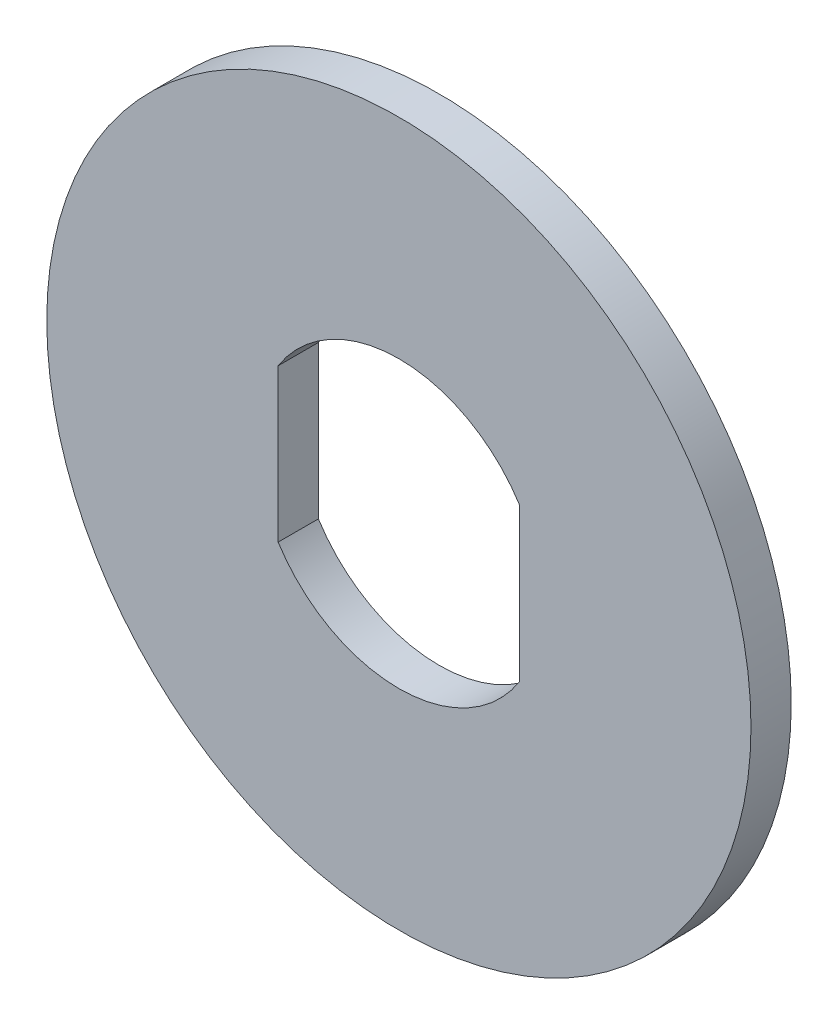
ISO-10303-21;
HEADER;
FILE_DESCRIPTION(('STEP AP214'),'2;1');
FILE_NAME('part.step','',(''),(''),'','','');
FILE_SCHEMA(('AUTOMOTIVE_DESIGN { 1 0 10303 214 1 1 1 1 }'));
ENDSEC;
DATA;
#1=APPLICATION_CONTEXT('core data for automotive mechanical design processes');
#2=APPLICATION_PROTOCOL_DEFINITION('international standard','automotive_design',2000,#1);
#3=PRODUCT_CONTEXT('',#1,'mechanical');
#4=PRODUCT('Part','Part','',(#3));
#5=PRODUCT_RELATED_PRODUCT_CATEGORY('part','',(#4));
#6=PRODUCT_DEFINITION_FORMATION('','',#4);
#7=PRODUCT_DEFINITION_CONTEXT('part definition',#1,'design');
#8=PRODUCT_DEFINITION('design','',#6,#7);
#9=PRODUCT_DEFINITION_SHAPE('','',#8);
#10=(LENGTH_UNIT() NAMED_UNIT(*) SI_UNIT(.MILLI.,.METRE.));
#11=(NAMED_UNIT(*) PLANE_ANGLE_UNIT() SI_UNIT($,.RADIAN.));
#12=(NAMED_UNIT(*) SI_UNIT($,.STERADIAN.) SOLID_ANGLE_UNIT());
#13=UNCERTAINTY_MEASURE_WITH_UNIT(LENGTH_MEASURE(1.E-05),#10,'distance_accuracy_value','');
#14=(GEOMETRIC_REPRESENTATION_CONTEXT(3) GLOBAL_UNCERTAINTY_ASSIGNED_CONTEXT((#13)) GLOBAL_UNIT_ASSIGNED_CONTEXT((#10,
#11,#12)) REPRESENTATION_CONTEXT('',''));
#15=CARTESIAN_POINT('',(0.,0.,0.));
#16=DIRECTION('',(0.,0.,1.));
#17=DIRECTION('',(1.,0.,0.));
#18=AXIS2_PLACEMENT_3D('',#15,#16,#17);
#19=CARTESIAN_POINT('',(0.,0.,2.));
#20=DIRECTION('',(0.,0.,1.));
#21=DIRECTION('',(1.,0.,0.));
#22=AXIS2_PLACEMENT_3D('',#19,#20,#21);
#23=PLANE('',#22);
#24=CARTESIAN_POINT('',(0.,0.,2.));
#25=DIRECTION('',(0.,0.,1.));
#26=DIRECTION('',(1.,0.,0.));
#27=AXIS2_PLACEMENT_3D('',#24,#25,#26);
#28=CIRCLE('',#27,17.5);
#29=CARTESIAN_POINT('',(17.5,0.,2.));
#30=VERTEX_POINT('',#29);
#31=EDGE_CURVE('E11',#30,#30,#28,.T.);
#32=ORIENTED_EDGE('',*,*,#31,.T.);
#33=EDGE_LOOP('',(#32));
#34=FACE_BOUND('',#33,.T.);
#35=DIRECTION('',(0.,-1.,0.));
#36=VECTOR('',#35,1.);
#37=CARTESIAN_POINT('',(-6.,3.79605057922046,2.));
#38=LINE('',#37,#36);
#39=CARTESIAN_POINT('',(-6.,3.79605057922046,2.));
#40=VERTEX_POINT('',#39);
#41=CARTESIAN_POINT('',(-6.,-3.79605057922046,2.));
#42=VERTEX_POINT('',#41);
#43=EDGE_CURVE('E416',#40,#42,#38,.T.);
#44=ORIENTED_EDGE('',*,*,#43,.F.);
#45=CARTESIAN_POINT('',(0.,0.,2.));
#46=DIRECTION('',(0.,0.,1.));
#47=DIRECTION('',(1.,0.,0.));
#48=AXIS2_PLACEMENT_3D('',#45,#46,#47);
#49=CIRCLE('',#48,7.1);
#50=CARTESIAN_POINT('',(6.,3.79605057922046,2.));
#51=VERTEX_POINT('',#50);
#52=EDGE_CURVE('E406',#51,#40,#49,.T.);
#53=ORIENTED_EDGE('',*,*,#52,.F.);
#54=DIRECTION('',(0.,1.,0.));
#55=VECTOR('',#54,1.);
#56=CARTESIAN_POINT('',(6.,3.79605057922046,2.));
#57=LINE('',#56,#55);
#58=CARTESIAN_POINT('',(6.,-3.79605057922046,2.));
#59=VERTEX_POINT('',#58);
#60=EDGE_CURVE('E420',#59,#51,#57,.T.);
#61=ORIENTED_EDGE('',*,*,#60,.F.);
#62=CARTESIAN_POINT('',(0.,0.,2.));
#63=DIRECTION('',(0.,0.,1.));
#64=DIRECTION('',(1.,0.,0.));
#65=AXIS2_PLACEMENT_3D('',#62,#63,#64);
#66=CIRCLE('',#65,7.1);
#67=EDGE_CURVE('E418',#42,#59,#66,.T.);
#68=ORIENTED_EDGE('',*,*,#67,.F.);
#69=EDGE_LOOP('',(#44,#53,#61,#68));
#70=FACE_BOUND('',#69,.T.);
#71=ADVANCED_FACE('F350',(#34,#70),#23,.T.);
#72=CARTESIAN_POINT('',(0.,0.,0.));
#73=DIRECTION('',(0.,0.,1.));
#74=DIRECTION('',(1.,0.,0.));
#75=AXIS2_PLACEMENT_3D('',#72,#73,#74);
#76=PLANE('',#75);
#77=CARTESIAN_POINT('',(0.,0.,0.));
#78=DIRECTION('',(0.,0.,1.));
#79=DIRECTION('',(1.,0.,0.));
#80=AXIS2_PLACEMENT_3D('',#77,#78,#79);
#81=CIRCLE('',#80,17.5);
#82=CARTESIAN_POINT('',(17.5,0.,0.));
#83=VERTEX_POINT('',#82);
#84=EDGE_CURVE('E358',#83,#83,#81,.T.);
#85=ORIENTED_EDGE('',*,*,#84,.F.);
#86=EDGE_LOOP('',(#85));
#87=FACE_BOUND('',#86,.T.);
#88=CARTESIAN_POINT('',(0.,0.,0.));
#89=DIRECTION('',(0.,0.,1.));
#90=DIRECTION('',(1.,0.,0.));
#91=AXIS2_PLACEMENT_3D('',#88,#89,#90);
#92=CIRCLE('',#91,7.1);
#93=CARTESIAN_POINT('',(6.,3.79605057922046,0.));
#94=VERTEX_POINT('',#93);
#95=CARTESIAN_POINT('',(-6.,3.79605057922046,0.));
#96=VERTEX_POINT('',#95);
#97=EDGE_CURVE('E373',#94,#96,#92,.T.);
#98=ORIENTED_EDGE('',*,*,#97,.T.);
#99=DIRECTION('',(0.,-1.,0.));
#100=VECTOR('',#99,1.);
#101=CARTESIAN_POINT('',(-6.,3.79605057922046,0.));
#102=LINE('',#101,#100);
#103=CARTESIAN_POINT('',(-6.,-3.79605057922046,0.));
#104=VERTEX_POINT('',#103);
#105=EDGE_CURVE('E393',#96,#104,#102,.T.);
#106=ORIENTED_EDGE('',*,*,#105,.T.);
#107=CARTESIAN_POINT('',(0.,0.,0.));
#108=DIRECTION('',(0.,0.,1.));
#109=DIRECTION('',(1.,0.,0.));
#110=AXIS2_PLACEMENT_3D('',#107,#108,#109);
#111=CIRCLE('',#110,7.1);
#112=CARTESIAN_POINT('',(6.,-3.79605057922046,0.));
#113=VERTEX_POINT('',#112);
#114=EDGE_CURVE('E402',#104,#113,#111,.T.);
#115=ORIENTED_EDGE('',*,*,#114,.T.);
#116=DIRECTION('',(0.,1.,0.));
#117=VECTOR('',#116,1.);
#118=CARTESIAN_POINT('',(6.,3.79605057922046,0.));
#119=LINE('',#118,#117);
#120=EDGE_CURVE('E410',#113,#94,#119,.T.);
#121=ORIENTED_EDGE('',*,*,#120,.T.);
#122=EDGE_LOOP('',(#98,#106,#115,#121));
#123=FACE_BOUND('',#122,.T.);
#124=ADVANCED_FACE('F409',(#87,#123),#76,.F.);
#125=CARTESIAN_POINT('',(0.,0.,2.));
#126=DIRECTION('',(0.,0.,-1.));
#127=DIRECTION('',(-1.,0.,0.));
#128=AXIS2_PLACEMENT_3D('',#125,#126,#127);
#129=CYLINDRICAL_SURFACE('',#128,17.5);
#130=ORIENTED_EDGE('',*,*,#31,.F.);
#131=EDGE_LOOP('',(#130));
#132=FACE_BOUND('',#131,.T.);
#133=ORIENTED_EDGE('',*,*,#84,.T.);
#134=EDGE_LOOP('',(#133));
#135=FACE_BOUND('',#134,.T.);
#136=ADVANCED_FACE('F352',(#132,#135),#129,.T.);
#137=CARTESIAN_POINT('',(0.,0.,2.));
#138=DIRECTION('',(0.,0.,-1.));
#139=DIRECTION('',(-1.,0.,0.));
#140=AXIS2_PLACEMENT_3D('',#137,#138,#139);
#141=CYLINDRICAL_SURFACE('',#140,7.1);
#142=ORIENTED_EDGE('',*,*,#97,.F.);
#143=DIRECTION('',(0.,0.,-1.));
#144=VECTOR('',#143,1.);
#145=CARTESIAN_POINT('',(6.,3.79605057922046,2.));
#146=LINE('',#145,#144);
#147=EDGE_CURVE('E422',#51,#94,#146,.T.);
#148=ORIENTED_EDGE('',*,*,#147,.F.);
#149=ORIENTED_EDGE('',*,*,#52,.T.);
#150=DIRECTION('',(0.,0.,-1.));
#151=VECTOR('',#150,1.);
#152=CARTESIAN_POINT('',(-6.,3.79605057922046,2.));
#153=LINE('',#152,#151);
#154=EDGE_CURVE('E395',#40,#96,#153,.T.);
#155=ORIENTED_EDGE('',*,*,#154,.T.);
#156=EDGE_LOOP('',(#142,#148,#149,#155));
#157=FACE_BOUND('',#156,.T.);
#158=ADVANCED_FACE('F404',(#157),#141,.F.);
#159=CARTESIAN_POINT('',(-6.,3.79605057922046,2.));
#160=DIRECTION('',(1.,0.,0.));
#161=DIRECTION('',(0.,1.,0.));
#162=AXIS2_PLACEMENT_3D('',#159,#160,#161);
#163=PLANE('',#162);
#164=ORIENTED_EDGE('',*,*,#105,.F.);
#165=ORIENTED_EDGE('',*,*,#154,.F.);
#166=ORIENTED_EDGE('',*,*,#43,.T.);
#167=DIRECTION('',(0.,0.,-1.));
#168=VECTOR('',#167,1.);
#169=CARTESIAN_POINT('',(-6.,-3.79605057922046,2.));
#170=LINE('',#169,#168);
#171=EDGE_CURVE('E398',#42,#104,#170,.T.);
#172=ORIENTED_EDGE('',*,*,#171,.T.);
#173=EDGE_LOOP('',(#164,#165,#166,#172));
#174=FACE_BOUND('',#173,.T.);
#175=ADVANCED_FACE('F394',(#174),#163,.T.);
#176=CARTESIAN_POINT('',(0.,0.,2.));
#177=DIRECTION('',(0.,0.,-1.));
#178=DIRECTION('',(-1.,0.,0.));
#179=AXIS2_PLACEMENT_3D('',#176,#177,#178);
#180=CYLINDRICAL_SURFACE('',#179,7.1);
#181=ORIENTED_EDGE('',*,*,#114,.F.);
#182=ORIENTED_EDGE('',*,*,#171,.F.);
#183=ORIENTED_EDGE('',*,*,#67,.T.);
#184=DIRECTION('',(0.,0.,-1.));
#185=VECTOR('',#184,1.);
#186=CARTESIAN_POINT('',(6.,-3.79605057922046,2.));
#187=LINE('',#186,#185);
#188=EDGE_CURVE('E365',#59,#113,#187,.T.);
#189=ORIENTED_EDGE('',*,*,#188,.T.);
#190=EDGE_LOOP('',(#181,#182,#183,#189));
#191=FACE_BOUND('',#190,.T.);
#192=ADVANCED_FACE('F442',(#191),#180,.F.);
#193=CARTESIAN_POINT('',(6.,3.79605057922046,2.));
#194=DIRECTION('',(-1.,0.,0.));
#195=DIRECTION('',(0.,-1.,0.));
#196=AXIS2_PLACEMENT_3D('',#193,#194,#195);
#197=PLANE('',#196);
#198=ORIENTED_EDGE('',*,*,#120,.F.);
#199=ORIENTED_EDGE('',*,*,#188,.F.);
#200=ORIENTED_EDGE('',*,*,#60,.T.);
#201=ORIENTED_EDGE('',*,*,#147,.T.);
#202=EDGE_LOOP('',(#198,#199,#200,#201));
#203=FACE_BOUND('',#202,.T.);
#204=ADVANCED_FACE('F445',(#203),#197,.T.);
#205=CLOSED_SHELL('',(#71,#124,#136,#158,#175,#192,#204));
#206=MANIFOLD_SOLID_BREP('B2',#205);
#207=ADVANCED_BREP_SHAPE_REPRESENTATION('',(#18,#206),#14);
#208=SHAPE_DEFINITION_REPRESENTATION(#9,#207);
ENDSEC;
END-ISO-10303-21;
